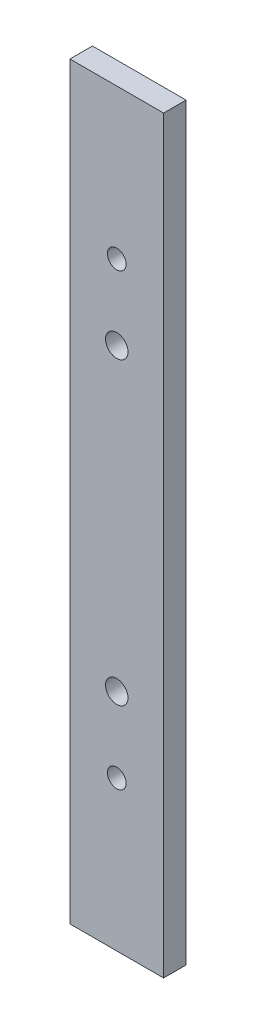
ISO-10303-21;
HEADER;
FILE_DESCRIPTION(('STEP AP214'),'2;1');
FILE_NAME('part.step','',(''),(''),'','','');
FILE_SCHEMA(('AUTOMOTIVE_DESIGN { 1 0 10303 214 1 1 1 1 }'));
ENDSEC;
DATA;
#1=APPLICATION_CONTEXT('core data for automotive mechanical design processes');
#2=APPLICATION_PROTOCOL_DEFINITION('international standard','automotive_design',2000,#1);
#3=PRODUCT_CONTEXT('',#1,'mechanical');
#4=PRODUCT('Part','Part','',(#3));
#5=PRODUCT_RELATED_PRODUCT_CATEGORY('part','',(#4));
#6=PRODUCT_DEFINITION_FORMATION('','',#4);
#7=PRODUCT_DEFINITION_CONTEXT('part definition',#1,'design');
#8=PRODUCT_DEFINITION('design','',#6,#7);
#9=PRODUCT_DEFINITION_SHAPE('','',#8);
#10=(LENGTH_UNIT() NAMED_UNIT(*) SI_UNIT(.MILLI.,.METRE.));
#11=(NAMED_UNIT(*) PLANE_ANGLE_UNIT() SI_UNIT($,.RADIAN.));
#12=(NAMED_UNIT(*) SI_UNIT($,.STERADIAN.) SOLID_ANGLE_UNIT());
#13=UNCERTAINTY_MEASURE_WITH_UNIT(LENGTH_MEASURE(1.E-05),#10,'distance_accuracy_value','');
#14=(GEOMETRIC_REPRESENTATION_CONTEXT(3) GLOBAL_UNCERTAINTY_ASSIGNED_CONTEXT((#13)) GLOBAL_UNIT_ASSIGNED_CONTEXT((#10,
#11,#12)) REPRESENTATION_CONTEXT('',''));
#15=CARTESIAN_POINT('',(0.,0.,0.));
#16=DIRECTION('',(0.,0.,1.));
#17=DIRECTION('',(1.,0.,0.));
#18=AXIS2_PLACEMENT_3D('',#15,#16,#17);
#19=CARTESIAN_POINT('',(12.5,-100.,6.));
#20=DIRECTION('',(-1.,0.,0.));
#21=DIRECTION('',(0.,0.,1.));
#22=AXIS2_PLACEMENT_3D('',#19,#20,#21);
#23=PLANE('',#22);
#24=DIRECTION('',(0.,1.,0.));
#25=VECTOR('',#24,1.);
#26=CARTESIAN_POINT('',(12.5,-100.,0.));
#27=LINE('',#26,#25);
#28=CARTESIAN_POINT('',(12.5,-100.,0.));
#29=VERTEX_POINT('',#28);
#30=CARTESIAN_POINT('',(12.5,100.,0.));
#31=VERTEX_POINT('',#30);
#32=EDGE_CURVE('E99',#29,#31,#27,.T.);
#33=ORIENTED_EDGE('',*,*,#32,.T.);
#34=DIRECTION('',(0.,0.,-1.));
#35=VECTOR('',#34,1.);
#36=CARTESIAN_POINT('',(12.5,100.,6.));
#37=LINE('',#36,#35);
#38=CARTESIAN_POINT('',(12.5,100.,6.));
#39=VERTEX_POINT('',#38);
#40=EDGE_CURVE('E11',#39,#31,#37,.T.);
#41=ORIENTED_EDGE('',*,*,#40,.F.);
#42=DIRECTION('',(0.,1.,0.));
#43=VECTOR('',#42,1.);
#44=CARTESIAN_POINT('',(12.5,-100.,6.));
#45=LINE('',#44,#43);
#46=CARTESIAN_POINT('',(12.5,-100.,6.));
#47=VERTEX_POINT('',#46);
#48=EDGE_CURVE('E87',#47,#39,#45,.T.);
#49=ORIENTED_EDGE('',*,*,#48,.F.);
#50=DIRECTION('',(0.,0.,-1.));
#51=VECTOR('',#50,1.);
#52=CARTESIAN_POINT('',(12.5,-100.,6.));
#53=LINE('',#52,#51);
#54=EDGE_CURVE('E95',#47,#29,#53,.T.);
#55=ORIENTED_EDGE('',*,*,#54,.T.);
#56=EDGE_LOOP('',(#33,#41,#49,#55));
#57=FACE_BOUND('',#56,.T.);
#58=ADVANCED_FACE('F36',(#57),#23,.F.);
#59=CARTESIAN_POINT('',(-12.5,100.,6.));
#60=DIRECTION('',(0.,-1.,0.));
#61=DIRECTION('',(0.,0.,-1.));
#62=AXIS2_PLACEMENT_3D('',#59,#60,#61);
#63=PLANE('',#62);
#64=DIRECTION('',(-1.,0.,0.));
#65=VECTOR('',#64,1.);
#66=CARTESIAN_POINT('',(-12.5,100.,0.));
#67=LINE('',#66,#65);
#68=CARTESIAN_POINT('',(-12.5,100.,0.));
#69=VERTEX_POINT('',#68);
#70=EDGE_CURVE('E91',#31,#69,#67,.T.);
#71=ORIENTED_EDGE('',*,*,#70,.T.);
#72=DIRECTION('',(0.,0.,-1.));
#73=VECTOR('',#72,1.);
#74=CARTESIAN_POINT('',(-12.5,100.,6.));
#75=LINE('',#74,#73);
#76=CARTESIAN_POINT('',(-12.5,100.,6.));
#77=VERTEX_POINT('',#76);
#78=EDGE_CURVE('E44',#77,#69,#75,.T.);
#79=ORIENTED_EDGE('',*,*,#78,.F.);
#80=DIRECTION('',(-1.,0.,0.));
#81=VECTOR('',#80,1.);
#82=CARTESIAN_POINT('',(-12.5,100.,6.));
#83=LINE('',#82,#81);
#84=EDGE_CURVE('E82',#39,#77,#83,.T.);
#85=ORIENTED_EDGE('',*,*,#84,.F.);
#86=ORIENTED_EDGE('',*,*,#40,.T.);
#87=EDGE_LOOP('',(#71,#79,#85,#86));
#88=FACE_BOUND('',#87,.T.);
#89=ADVANCED_FACE('F90',(#88),#63,.F.);
#90=CARTESIAN_POINT('',(-12.5,-100.,6.));
#91=DIRECTION('',(1.,0.,0.));
#92=DIRECTION('',(0.,0.,-1.));
#93=AXIS2_PLACEMENT_3D('',#90,#91,#92);
#94=PLANE('',#93);
#95=DIRECTION('',(0.,-1.,0.));
#96=VECTOR('',#95,1.);
#97=CARTESIAN_POINT('',(-12.5,-100.,0.));
#98=LINE('',#97,#96);
#99=CARTESIAN_POINT('',(-12.5,-100.,0.));
#100=VERTEX_POINT('',#99);
#101=EDGE_CURVE('E69',#69,#100,#98,.T.);
#102=ORIENTED_EDGE('',*,*,#101,.T.);
#103=DIRECTION('',(0.,0.,-1.));
#104=VECTOR('',#103,1.);
#105=CARTESIAN_POINT('',(-12.5,-100.,6.));
#106=LINE('',#105,#104);
#107=CARTESIAN_POINT('',(-12.5,-100.,6.));
#108=VERTEX_POINT('',#107);
#109=EDGE_CURVE('E92',#108,#100,#106,.T.);
#110=ORIENTED_EDGE('',*,*,#109,.F.);
#111=DIRECTION('',(0.,-1.,0.));
#112=VECTOR('',#111,1.);
#113=CARTESIAN_POINT('',(-12.5,-100.,6.));
#114=LINE('',#113,#112);
#115=EDGE_CURVE('E85',#77,#108,#114,.T.);
#116=ORIENTED_EDGE('',*,*,#115,.F.);
#117=ORIENTED_EDGE('',*,*,#78,.T.);
#118=EDGE_LOOP('',(#102,#110,#116,#117));
#119=FACE_BOUND('',#118,.T.);
#120=ADVANCED_FACE('F93',(#119),#94,.F.);
#121=CARTESIAN_POINT('',(-12.5,-100.,6.));
#122=DIRECTION('',(0.,1.,0.));
#123=DIRECTION('',(-1.,0.,0.));
#124=AXIS2_PLACEMENT_3D('',#121,#122,#123);
#125=PLANE('',#124);
#126=DIRECTION('',(1.,0.,0.));
#127=VECTOR('',#126,1.);
#128=CARTESIAN_POINT('',(-12.5,-100.,0.));
#129=LINE('',#128,#127);
#130=EDGE_CURVE('E75',#100,#29,#129,.T.);
#131=ORIENTED_EDGE('',*,*,#130,.T.);
#132=ORIENTED_EDGE('',*,*,#54,.F.);
#133=DIRECTION('',(1.,0.,0.));
#134=VECTOR('',#133,1.);
#135=CARTESIAN_POINT('',(-12.5,-100.,6.));
#136=LINE('',#135,#134);
#137=EDGE_CURVE('E52',#108,#47,#136,.T.);
#138=ORIENTED_EDGE('',*,*,#137,.F.);
#139=ORIENTED_EDGE('',*,*,#109,.T.);
#140=EDGE_LOOP('',(#131,#132,#138,#139));
#141=FACE_BOUND('',#140,.T.);
#142=ADVANCED_FACE('F107',(#141),#125,.F.);
#143=CARTESIAN_POINT('',(0.,0.,6.));
#144=DIRECTION('',(0.,0.,-1.));
#145=DIRECTION('',(-1.,0.,0.));
#146=AXIS2_PLACEMENT_3D('',#143,#144,#145);
#147=PLANE('',#146);
#148=CARTESIAN_POINT('',(2.22044604925031E-13,-59.9999999999977,6.));
#149=DIRECTION('',(0.,0.,1.));
#150=DIRECTION('',(1.,0.,0.));
#151=AXIS2_PLACEMENT_3D('',#148,#149,#150);
#152=CIRCLE('',#151,2.5);
#153=CARTESIAN_POINT('',(2.50000000000022,-59.9999999999977,6.));
#154=VERTEX_POINT('',#153);
#155=EDGE_CURVE('E126',#154,#154,#152,.T.);
#156=ORIENTED_EDGE('',*,*,#155,.F.);
#157=EDGE_LOOP('',(#156));
#158=FACE_BOUND('',#157,.T.);
#159=CARTESIAN_POINT('',(0.,40.,6.));
#160=DIRECTION('',(0.,0.,1.));
#161=DIRECTION('',(-1.,0.,0.));
#162=AXIS2_PLACEMENT_3D('',#159,#160,#161);
#163=CIRCLE('',#162,3.);
#164=CARTESIAN_POINT('',(-3.00000000000002,40.,6.));
#165=VERTEX_POINT('',#164);
#166=EDGE_CURVE('E127',#165,#165,#163,.T.);
#167=ORIENTED_EDGE('',*,*,#166,.F.);
#168=EDGE_LOOP('',(#167));
#169=FACE_BOUND('',#168,.T.);
#170=CARTESIAN_POINT('',(0.,-40.,6.));
#171=DIRECTION('',(0.,0.,1.));
#172=DIRECTION('',(1.,0.,0.));
#173=AXIS2_PLACEMENT_3D('',#170,#171,#172);
#174=CIRCLE('',#173,3.);
#175=CARTESIAN_POINT('',(2.99999999999999,-40.,6.));
#176=VERTEX_POINT('',#175);
#177=EDGE_CURVE('E113',#176,#176,#174,.T.);
#178=ORIENTED_EDGE('',*,*,#177,.F.);
#179=EDGE_LOOP('',(#178));
#180=FACE_BOUND('',#179,.T.);
#181=CARTESIAN_POINT('',(2.8796409701215E-13,59.9999999999977,6.));
#182=DIRECTION('',(0.,0.,1.));
#183=DIRECTION('',(-1.,0.,0.));
#184=AXIS2_PLACEMENT_3D('',#181,#182,#183);
#185=CIRCLE('',#184,2.5);
#186=CARTESIAN_POINT('',(-2.49999999999971,59.9999999999977,6.));
#187=VERTEX_POINT('',#186);
#188=EDGE_CURVE('E120',#187,#187,#185,.T.);
#189=ORIENTED_EDGE('',*,*,#188,.F.);
#190=EDGE_LOOP('',(#189));
#191=FACE_BOUND('',#190,.T.);
#192=ORIENTED_EDGE('',*,*,#48,.T.);
#193=ORIENTED_EDGE('',*,*,#84,.T.);
#194=ORIENTED_EDGE('',*,*,#115,.T.);
#195=ORIENTED_EDGE('',*,*,#137,.T.);
#196=EDGE_LOOP('',(#192,#193,#194,#195));
#197=FACE_BOUND('',#196,.T.);
#198=ADVANCED_FACE('F83',(#158,#169,#180,#191,#197),#147,.F.);
#199=CARTESIAN_POINT('',(0.,0.,0.));
#200=DIRECTION('',(0.,0.,-1.));
#201=DIRECTION('',(-1.,0.,0.));
#202=AXIS2_PLACEMENT_3D('',#199,#200,#201);
#203=PLANE('',#202);
#204=CARTESIAN_POINT('',(2.22044604925031E-13,-59.9999999999977,0.));
#205=DIRECTION('',(0.,0.,1.));
#206=DIRECTION('',(1.,0.,0.));
#207=AXIS2_PLACEMENT_3D('',#204,#205,#206);
#208=CIRCLE('',#207,2.5);
#209=CARTESIAN_POINT('',(2.50000000000022,-59.9999999999977,0.));
#210=VERTEX_POINT('',#209);
#211=EDGE_CURVE('E102',#210,#210,#208,.T.);
#212=ORIENTED_EDGE('',*,*,#211,.T.);
#213=EDGE_LOOP('',(#212));
#214=FACE_BOUND('',#213,.T.);
#215=CARTESIAN_POINT('',(0.,40.,0.));
#216=DIRECTION('',(0.,0.,1.));
#217=DIRECTION('',(-1.,0.,0.));
#218=AXIS2_PLACEMENT_3D('',#215,#216,#217);
#219=CIRCLE('',#218,3.);
#220=CARTESIAN_POINT('',(-3.00000000000002,40.,0.));
#221=VERTEX_POINT('',#220);
#222=EDGE_CURVE('E117',#221,#221,#219,.T.);
#223=ORIENTED_EDGE('',*,*,#222,.T.);
#224=EDGE_LOOP('',(#223));
#225=FACE_BOUND('',#224,.T.);
#226=CARTESIAN_POINT('',(0.,-40.,0.));
#227=DIRECTION('',(0.,0.,1.));
#228=DIRECTION('',(1.,0.,0.));
#229=AXIS2_PLACEMENT_3D('',#226,#227,#228);
#230=CIRCLE('',#229,3.);
#231=CARTESIAN_POINT('',(2.99999999999999,-40.,0.));
#232=VERTEX_POINT('',#231);
#233=EDGE_CURVE('E116',#232,#232,#230,.T.);
#234=ORIENTED_EDGE('',*,*,#233,.T.);
#235=EDGE_LOOP('',(#234));
#236=FACE_BOUND('',#235,.T.);
#237=CARTESIAN_POINT('',(2.8796409701215E-13,59.9999999999977,0.));
#238=DIRECTION('',(0.,0.,1.));
#239=DIRECTION('',(-1.,0.,0.));
#240=AXIS2_PLACEMENT_3D('',#237,#238,#239);
#241=CIRCLE('',#240,2.5);
#242=CARTESIAN_POINT('',(-2.49999999999971,59.9999999999977,0.));
#243=VERTEX_POINT('',#242);
#244=EDGE_CURVE('E123',#243,#243,#241,.T.);
#245=ORIENTED_EDGE('',*,*,#244,.T.);
#246=EDGE_LOOP('',(#245));
#247=FACE_BOUND('',#246,.T.);
#248=ORIENTED_EDGE('',*,*,#32,.F.);
#249=ORIENTED_EDGE('',*,*,#130,.F.);
#250=ORIENTED_EDGE('',*,*,#101,.F.);
#251=ORIENTED_EDGE('',*,*,#70,.F.);
#252=EDGE_LOOP('',(#248,#249,#250,#251));
#253=FACE_BOUND('',#252,.T.);
#254=ADVANCED_FACE('F110',(#214,#225,#236,#247,#253),#203,.T.);
#255=CARTESIAN_POINT('',(2.8796409701215E-13,59.9999999999977,0.));
#256=DIRECTION('',(0.,0.,1.));
#257=DIRECTION('',(1.,0.,0.));
#258=AXIS2_PLACEMENT_3D('',#255,#256,#257);
#259=CYLINDRICAL_SURFACE('',#258,2.5);
#260=ORIENTED_EDGE('',*,*,#244,.F.);
#261=EDGE_LOOP('',(#260));
#262=FACE_BOUND('',#261,.T.);
#263=ORIENTED_EDGE('',*,*,#188,.T.);
#264=EDGE_LOOP('',(#263));
#265=FACE_BOUND('',#264,.T.);
#266=ADVANCED_FACE('F155',(#262,#265),#259,.F.);
#267=CARTESIAN_POINT('',(0.,-40.,0.));
#268=DIRECTION('',(0.,0.,1.));
#269=DIRECTION('',(1.,0.,0.));
#270=AXIS2_PLACEMENT_3D('',#267,#268,#269);
#271=CYLINDRICAL_SURFACE('',#270,3.);
#272=ORIENTED_EDGE('',*,*,#233,.F.);
#273=EDGE_LOOP('',(#272));
#274=FACE_BOUND('',#273,.T.);
#275=ORIENTED_EDGE('',*,*,#177,.T.);
#276=EDGE_LOOP('',(#275));
#277=FACE_BOUND('',#276,.T.);
#278=ADVANCED_FACE('F157',(#274,#277),#271,.F.);
#279=CARTESIAN_POINT('',(0.,40.,0.));
#280=DIRECTION('',(0.,0.,1.));
#281=DIRECTION('',(1.,0.,0.));
#282=AXIS2_PLACEMENT_3D('',#279,#280,#281);
#283=CYLINDRICAL_SURFACE('',#282,3.);
#284=ORIENTED_EDGE('',*,*,#222,.F.);
#285=EDGE_LOOP('',(#284));
#286=FACE_BOUND('',#285,.T.);
#287=ORIENTED_EDGE('',*,*,#166,.T.);
#288=EDGE_LOOP('',(#287));
#289=FACE_BOUND('',#288,.T.);
#290=ADVANCED_FACE('F142',(#286,#289),#283,.F.);
#291=CARTESIAN_POINT('',(2.22044604925031E-13,-59.9999999999977,0.));
#292=DIRECTION('',(0.,0.,1.));
#293=DIRECTION('',(1.,0.,0.));
#294=AXIS2_PLACEMENT_3D('',#291,#292,#293);
#295=CYLINDRICAL_SURFACE('',#294,2.5);
#296=ORIENTED_EDGE('',*,*,#211,.F.);
#297=EDGE_LOOP('',(#296));
#298=FACE_BOUND('',#297,.T.);
#299=ORIENTED_EDGE('',*,*,#155,.T.);
#300=EDGE_LOOP('',(#299));
#301=FACE_BOUND('',#300,.T.);
#302=ADVANCED_FACE('F139',(#298,#301),#295,.F.);
#303=CLOSED_SHELL('',(#58,#89,#120,#142,#198,#254,#266,#278,#290,#302));
#304=MANIFOLD_SOLID_BREP('B2',#303);
#305=ADVANCED_BREP_SHAPE_REPRESENTATION('',(#18,#304),#14);
#306=SHAPE_DEFINITION_REPRESENTATION(#9,#305);
ENDSEC;
END-ISO-10303-21;
